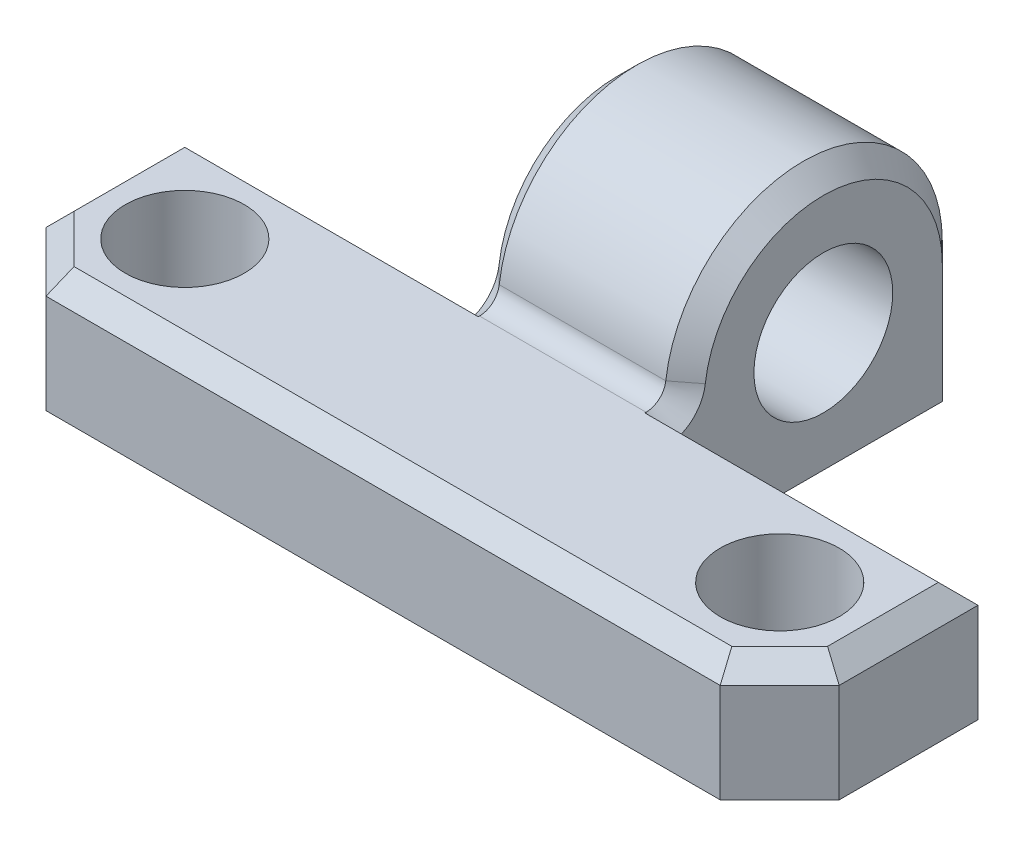
ISO-10303-21;
HEADER;
FILE_DESCRIPTION(('STEP AP214'),'2;1');
FILE_NAME('part.step','',(''),(''),'','','');
FILE_SCHEMA(('AUTOMOTIVE_DESIGN { 1 0 10303 214 1 1 1 1 }'));
ENDSEC;
DATA;
#1=APPLICATION_CONTEXT('core data for automotive mechanical design processes');
#2=APPLICATION_PROTOCOL_DEFINITION('international standard','automotive_design',2000,#1);
#3=PRODUCT_CONTEXT('',#1,'mechanical');
#4=PRODUCT('Part','Part','',(#3));
#5=PRODUCT_RELATED_PRODUCT_CATEGORY('part','',(#4));
#6=PRODUCT_DEFINITION_FORMATION('','',#4);
#7=PRODUCT_DEFINITION_CONTEXT('part definition',#1,'design');
#8=PRODUCT_DEFINITION('design','',#6,#7);
#9=PRODUCT_DEFINITION_SHAPE('','',#8);
#10=(LENGTH_UNIT() NAMED_UNIT(*) SI_UNIT(.MILLI.,.METRE.));
#11=(NAMED_UNIT(*) PLANE_ANGLE_UNIT() SI_UNIT($,.RADIAN.));
#12=(NAMED_UNIT(*) SI_UNIT($,.STERADIAN.) SOLID_ANGLE_UNIT());
#13=UNCERTAINTY_MEASURE_WITH_UNIT(LENGTH_MEASURE(1.E-05),#10,'distance_accuracy_value','');
#14=(GEOMETRIC_REPRESENTATION_CONTEXT(3) GLOBAL_UNCERTAINTY_ASSIGNED_CONTEXT((#13)) GLOBAL_UNIT_ASSIGNED_CONTEXT((#10,
#11,#12)) REPRESENTATION_CONTEXT('',''));
#15=CARTESIAN_POINT('',(0.,0.,0.));
#16=DIRECTION('',(0.,0.,1.));
#17=DIRECTION('',(1.,0.,0.));
#18=AXIS2_PLACEMENT_3D('',#15,#16,#17);
#19=CARTESIAN_POINT('',(-10.,3.,-6.));
#20=DIRECTION('',(1.,0.,0.));
#21=DIRECTION('',(0.,0.,-1.));
#22=AXIS2_PLACEMENT_3D('',#19,#20,#21);
#23=PLANE('',#22);
#24=DIRECTION('',(0.,1.,0.));
#25=VECTOR('',#24,1.);
#26=CARTESIAN_POINT('',(-10.,3.,4.5));
#27=LINE('',#26,#25);
#28=CARTESIAN_POINT('',(-10.,0.,4.5));
#29=VERTEX_POINT('',#28);
#30=CARTESIAN_POINT('',(-10.,2.5,4.5));
#31=VERTEX_POINT('',#30);
#32=EDGE_CURVE('E238',#29,#31,#27,.T.);
#33=ORIENTED_EDGE('',*,*,#32,.T.);
#34=DIRECTION('',(0.,0.,-1.));
#35=VECTOR('',#34,1.);
#36=CARTESIAN_POINT('',(-10.,2.5,-6.));
#37=LINE('',#36,#35);
#38=CARTESIAN_POINT('',(-10.,2.5,1.));
#39=VERTEX_POINT('',#38);
#40=EDGE_CURVE('E189',#31,#39,#37,.T.);
#41=ORIENTED_EDGE('',*,*,#40,.T.);
#42=DIRECTION('',(0.,-1.,0.));
#43=VECTOR('',#42,1.);
#44=CARTESIAN_POINT('',(-10.,6.5,1.));
#45=LINE('',#44,#43);
#46=CARTESIAN_POINT('',(-10.,0.,1.));
#47=VERTEX_POINT('',#46);
#48=EDGE_CURVE('E182',#39,#47,#45,.T.);
#49=ORIENTED_EDGE('',*,*,#48,.T.);
#50=DIRECTION('',(0.,0.,1.));
#51=VECTOR('',#50,1.);
#52=CARTESIAN_POINT('',(-10.,0.,-6.));
#53=LINE('',#52,#51);
#54=EDGE_CURVE('E186',#47,#29,#53,.T.);
#55=ORIENTED_EDGE('',*,*,#54,.T.);
#56=EDGE_LOOP('',(#33,#41,#49,#55));
#57=FACE_BOUND('',#56,.T.);
#58=ADVANCED_FACE('F37',(#57),#23,.F.);
#59=CARTESIAN_POINT('',(10.,3.,-6.));
#60=DIRECTION('',(-1.,0.,0.));
#61=DIRECTION('',(0.,0.,1.));
#62=AXIS2_PLACEMENT_3D('',#59,#60,#61);
#63=PLANE('',#62);
#64=DIRECTION('',(0.,-1.,0.));
#65=VECTOR('',#64,1.);
#66=CARTESIAN_POINT('',(10.,6.5,1.));
#67=LINE('',#66,#65);
#68=CARTESIAN_POINT('',(10.,2.5,1.));
#69=VERTEX_POINT('',#68);
#70=CARTESIAN_POINT('',(10.,0.,1.));
#71=VERTEX_POINT('',#70);
#72=EDGE_CURVE('E496',#69,#71,#67,.T.);
#73=ORIENTED_EDGE('',*,*,#72,.F.);
#74=DIRECTION('',(0.,0.,1.));
#75=VECTOR('',#74,1.);
#76=CARTESIAN_POINT('',(10.,2.5,-6.));
#77=LINE('',#76,#75);
#78=CARTESIAN_POINT('',(10.,2.5,4.5));
#79=VERTEX_POINT('',#78);
#80=EDGE_CURVE('E265',#69,#79,#77,.T.);
#81=ORIENTED_EDGE('',*,*,#80,.T.);
#82=DIRECTION('',(0.,-1.,0.));
#83=VECTOR('',#82,1.);
#84=CARTESIAN_POINT('',(10.,3.,4.5));
#85=LINE('',#84,#83);
#86=CARTESIAN_POINT('',(10.,0.,4.5));
#87=VERTEX_POINT('',#86);
#88=EDGE_CURVE('E228',#79,#87,#85,.T.);
#89=ORIENTED_EDGE('',*,*,#88,.T.);
#90=DIRECTION('',(0.,0.,-1.));
#91=VECTOR('',#90,1.);
#92=CARTESIAN_POINT('',(10.,0.,-6.));
#93=LINE('',#92,#91);
#94=EDGE_CURVE('E214',#87,#71,#93,.T.);
#95=ORIENTED_EDGE('',*,*,#94,.T.);
#96=EDGE_LOOP('',(#73,#81,#89,#95));
#97=FACE_BOUND('',#96,.T.);
#98=ADVANCED_FACE('F386',(#97),#63,.F.);
#99=CARTESIAN_POINT('',(10.,3.,-6.));
#100=DIRECTION('',(0.,0.,1.));
#101=DIRECTION('',(1.,0.,0.));
#102=AXIS2_PLACEMENT_3D('',#99,#100,#101);
#103=PLANE('',#102);
#104=DIRECTION('',(-1.,0.,0.));
#105=VECTOR('',#104,1.);
#106=CARTESIAN_POINT('',(10.,3.,-6.));
#107=LINE('',#106,#105);
#108=CARTESIAN_POINT('',(2.1,3.,-6.));
#109=VERTEX_POINT('',#108);
#110=CARTESIAN_POINT('',(-2.10000000000001,3.,-6.));
#111=VERTEX_POINT('',#110);
#112=EDGE_CURVE('E220',#109,#111,#107,.T.);
#113=ORIENTED_EDGE('',*,*,#112,.F.);
#114=DIRECTION('',(0.,-1.,0.));
#115=VECTOR('',#114,1.);
#116=CARTESIAN_POINT('',(2.1,0.,-6.));
#117=LINE('',#116,#115);
#118=CARTESIAN_POINT('',(2.1,0.,-6.));
#119=VERTEX_POINT('',#118);
#120=EDGE_CURVE('E322',#109,#119,#117,.T.);
#121=ORIENTED_EDGE('',*,*,#120,.T.);
#122=DIRECTION('',(-1.,0.,0.));
#123=VECTOR('',#122,1.);
#124=CARTESIAN_POINT('',(10.,0.,-6.));
#125=LINE('',#124,#123);
#126=CARTESIAN_POINT('',(-2.10000000000001,0.,-6.));
#127=VERTEX_POINT('',#126);
#128=EDGE_CURVE('E225',#119,#127,#125,.T.);
#129=ORIENTED_EDGE('',*,*,#128,.T.);
#130=DIRECTION('',(0.,1.,0.));
#131=VECTOR('',#130,1.);
#132=CARTESIAN_POINT('',(-2.10000000000001,3.,-6.));
#133=LINE('',#132,#131);
#134=EDGE_CURVE('E320',#127,#111,#133,.T.);
#135=ORIENTED_EDGE('',*,*,#134,.T.);
#136=EDGE_LOOP('',(#113,#121,#129,#135));
#137=FACE_BOUND('',#136,.T.);
#138=ADVANCED_FACE('F392',(#137),#103,.F.);
#139=CARTESIAN_POINT('',(0.,0.,0.));
#140=DIRECTION('',(0.,-1.,0.));
#141=DIRECTION('',(0.,0.,-1.));
#142=AXIS2_PLACEMENT_3D('',#139,#140,#141);
#143=PLANE('',#142);
#144=CARTESIAN_POINT('',(-7.5,0.,3.5));
#145=DIRECTION('',(0.,-1.,0.));
#146=DIRECTION('',(0.,0.,-1.));
#147=AXIS2_PLACEMENT_3D('',#144,#145,#146);
#148=CIRCLE('',#147,1.5);
#149=CARTESIAN_POINT('',(-7.5,0.,5.));
#150=VERTEX_POINT('',#149);
#151=EDGE_CURVE('E217',#150,#150,#148,.F.);
#152=ORIENTED_EDGE('',*,*,#151,.T.);
#153=EDGE_LOOP('',(#152));
#154=FACE_BOUND('',#153,.T.);
#155=CARTESIAN_POINT('',(7.5,0.,3.5));
#156=DIRECTION('',(0.,-1.,0.));
#157=DIRECTION('',(0.,0.,-1.));
#158=AXIS2_PLACEMENT_3D('',#155,#156,#157);
#159=CIRCLE('',#158,1.5);
#160=CARTESIAN_POINT('',(7.5,0.,5.));
#161=VERTEX_POINT('',#160);
#162=EDGE_CURVE('E246',#161,#161,#159,.F.);
#163=ORIENTED_EDGE('',*,*,#162,.T.);
#164=EDGE_LOOP('',(#163));
#165=FACE_BOUND('',#164,.T.);
#166=ORIENTED_EDGE('',*,*,#128,.F.);
#167=DIRECTION('',(0.707106781186547,0.,0.707106781186548));
#168=VECTOR('',#167,1.);
#169=CARTESIAN_POINT('',(4.05,0.,-4.05));
#170=LINE('',#169,#168);
#171=CARTESIAN_POINT('',(2.6,0.,-5.5));
#172=VERTEX_POINT('',#171);
#173=EDGE_CURVE('E326',#119,#172,#170,.T.);
#174=ORIENTED_EDGE('',*,*,#173,.T.);
#175=DIRECTION('',(0.,0.,1.));
#176=VECTOR('',#175,1.);
#177=CARTESIAN_POINT('',(2.6,0.,-6.));
#178=LINE('',#177,#176);
#179=CARTESIAN_POINT('',(2.6,0.,1.));
#180=VERTEX_POINT('',#179);
#181=EDGE_CURVE('E298',#172,#180,#178,.T.);
#182=ORIENTED_EDGE('',*,*,#181,.T.);
#183=DIRECTION('',(1.,0.,0.));
#184=VECTOR('',#183,1.);
#185=CARTESIAN_POINT('',(10.,0.,1.));
#186=LINE('',#185,#184);
#187=EDGE_CURVE('E494',#180,#71,#186,.T.);
#188=ORIENTED_EDGE('',*,*,#187,.T.);
#189=ORIENTED_EDGE('',*,*,#94,.F.);
#190=DIRECTION('',(0.707106781186549,0.,-0.707106781186546));
#191=VECTOR('',#190,1.);
#192=CARTESIAN_POINT('',(7.24999999999998,0.,7.25000000000001));
#193=LINE('',#192,#191);
#194=CARTESIAN_POINT('',(8.49999999999999,0.,6.));
#195=VERTEX_POINT('',#194);
#196=EDGE_CURVE('E231',#87,#195,#193,.F.);
#197=ORIENTED_EDGE('',*,*,#196,.T.);
#198=DIRECTION('',(1.,0.,0.));
#199=VECTOR('',#198,1.);
#200=CARTESIAN_POINT('',(10.,0.,6.));
#201=LINE('',#200,#199);
#202=CARTESIAN_POINT('',(-8.5,0.,6.));
#203=VERTEX_POINT('',#202);
#204=EDGE_CURVE('E210',#203,#195,#201,.T.);
#205=ORIENTED_EDGE('',*,*,#204,.F.);
#206=DIRECTION('',(0.707106781186546,0.,0.707106781186549));
#207=VECTOR('',#206,1.);
#208=CARTESIAN_POINT('',(-7.25000000000002,0.,7.24999999999999));
#209=LINE('',#208,#207);
#210=EDGE_CURVE('E208',#203,#29,#209,.F.);
#211=ORIENTED_EDGE('',*,*,#210,.T.);
#212=ORIENTED_EDGE('',*,*,#54,.F.);
#213=DIRECTION('',(1.,0.,0.));
#214=VECTOR('',#213,1.);
#215=CARTESIAN_POINT('',(-10.,0.,1.));
#216=LINE('',#215,#214);
#217=CARTESIAN_POINT('',(-2.6,0.,1.));
#218=VERTEX_POINT('',#217);
#219=EDGE_CURVE('E196',#47,#218,#216,.T.);
#220=ORIENTED_EDGE('',*,*,#219,.T.);
#221=DIRECTION('',(0.,0.,-1.));
#222=VECTOR('',#221,1.);
#223=CARTESIAN_POINT('',(-2.6,0.,-6.));
#224=LINE('',#223,#222);
#225=CARTESIAN_POINT('',(-2.6,0.,-5.50000000000001));
#226=VERTEX_POINT('',#225);
#227=EDGE_CURVE('E202',#218,#226,#224,.T.);
#228=ORIENTED_EDGE('',*,*,#227,.T.);
#229=DIRECTION('',(0.707106781186547,0.,-0.707106781186548));
#230=VECTOR('',#229,1.);
#231=CARTESIAN_POINT('',(-4.05000000000001,0.,-4.05));
#232=LINE('',#231,#230);
#233=EDGE_CURVE('E324',#226,#127,#232,.T.);
#234=ORIENTED_EDGE('',*,*,#233,.T.);
#235=EDGE_LOOP('',(#166,#174,#182,#188,#189,#197,#205,#211,#212,#220,#228,#234));
#236=FACE_BOUND('',#235,.T.);
#237=ADVANCED_FACE('F205',(#154,#165,#236),#143,.T.);
#238=CARTESIAN_POINT('',(10.,3.,-2.5));
#239=DIRECTION('',(-1.,0.,0.));
#240=DIRECTION('',(0.,0.,1.));
#241=AXIS2_PLACEMENT_3D('',#238,#239,#240);
#242=CYLINDRICAL_SURFACE('',#241,3.5);
#243=DIRECTION('',(-1.,0.,0.));
#244=VECTOR('',#243,1.);
#245=CARTESIAN_POINT('',(10.,3.4375,0.972548595772275));
#246=LINE('',#245,#244);
#247=CARTESIAN_POINT('',(-2.10000000000001,3.4375,0.972548595772275));
#248=VERTEX_POINT('',#247);
#249=CARTESIAN_POINT('',(2.1,3.4375,0.972548595772275));
#250=VERTEX_POINT('',#249);
#251=EDGE_CURVE('E301',#248,#250,#246,.F.);
#252=ORIENTED_EDGE('',*,*,#251,.T.);
#253=CARTESIAN_POINT('',(2.1,3.,-2.5));
#254=DIRECTION('',(1.,0.,0.));
#255=DIRECTION('',(0.,0.,-1.));
#256=AXIS2_PLACEMENT_3D('',#253,#254,#255);
#257=CIRCLE('',#256,3.5);
#258=EDGE_CURVE('E330',#250,#109,#257,.F.);
#259=ORIENTED_EDGE('',*,*,#258,.T.);
#260=ORIENTED_EDGE('',*,*,#112,.T.);
#261=CARTESIAN_POINT('',(-2.10000000000001,3.,-2.5));
#262=DIRECTION('',(-1.,0.,0.));
#263=DIRECTION('',(0.,0.,1.));
#264=AXIS2_PLACEMENT_3D('',#261,#262,#263);
#265=CIRCLE('',#264,3.5);
#266=EDGE_CURVE('E328',#111,#248,#265,.F.);
#267=ORIENTED_EDGE('',*,*,#266,.T.);
#268=EDGE_LOOP('',(#252,#259,#260,#267));
#269=FACE_BOUND('',#268,.T.);
#270=ADVANCED_FACE('F478',(#269),#242,.T.);
#271=CARTESIAN_POINT('',(10.,3.,6.));
#272=DIRECTION('',(0.,0.,-1.));
#273=DIRECTION('',(-1.,0.,0.));
#274=AXIS2_PLACEMENT_3D('',#271,#272,#273);
#275=PLANE('',#274);
#276=DIRECTION('',(0.,1.,0.));
#277=VECTOR('',#276,1.);
#278=CARTESIAN_POINT('',(8.49999999999999,3.,6.));
#279=LINE('',#278,#277);
#280=CARTESIAN_POINT('',(8.49999999999999,2.5,6.));
#281=VERTEX_POINT('',#280);
#282=EDGE_CURVE('E235',#195,#281,#279,.T.);
#283=ORIENTED_EDGE('',*,*,#282,.T.);
#284=DIRECTION('',(-1.,0.,0.));
#285=VECTOR('',#284,1.);
#286=CARTESIAN_POINT('',(10.,2.5,6.));
#287=LINE('',#286,#285);
#288=CARTESIAN_POINT('',(-8.5,2.5,6.));
#289=VERTEX_POINT('',#288);
#290=EDGE_CURVE('E269',#281,#289,#287,.T.);
#291=ORIENTED_EDGE('',*,*,#290,.T.);
#292=DIRECTION('',(0.,-1.,0.));
#293=VECTOR('',#292,1.);
#294=CARTESIAN_POINT('',(-8.5,3.,6.));
#295=LINE('',#294,#293);
#296=EDGE_CURVE('E233',#289,#203,#295,.T.);
#297=ORIENTED_EDGE('',*,*,#296,.T.);
#298=ORIENTED_EDGE('',*,*,#204,.T.);
#299=EDGE_LOOP('',(#283,#291,#297,#298));
#300=FACE_BOUND('',#299,.T.);
#301=ADVANCED_FACE('F397',(#300),#275,.F.);
#302=CARTESIAN_POINT('',(0.,3.,0.));
#303=DIRECTION('',(0.,-1.,0.));
#304=DIRECTION('',(0.,0.,-1.));
#305=AXIS2_PLACEMENT_3D('',#302,#303,#304);
#306=PLANE('',#305);
#307=DIRECTION('',(-1.,0.,0.));
#308=VECTOR('',#307,1.);
#309=CARTESIAN_POINT('',(2.6,3.,1.5));
#310=LINE('',#309,#308);
#311=CARTESIAN_POINT('',(9.5,3.,1.5));
#312=VERTEX_POINT('',#311);
#313=CARTESIAN_POINT('',(2.1,3.,1.5));
#314=VERTEX_POINT('',#313);
#315=EDGE_CURVE('E256',#312,#314,#310,.T.);
#316=ORIENTED_EDGE('',*,*,#315,.T.);
#317=DIRECTION('',(0.,0.,-1.));
#318=VECTOR('',#317,1.);
#319=CARTESIAN_POINT('',(2.1,3.,1.46862696659689));
#320=LINE('',#319,#318);
#321=CARTESIAN_POINT('',(2.1,3.,1.46862696659689));
#322=VERTEX_POINT('',#321);
#323=EDGE_CURVE('E307',#314,#322,#320,.T.);
#324=ORIENTED_EDGE('',*,*,#323,.T.);
#325=DIRECTION('',(-1.,0.,0.));
#326=VECTOR('',#325,1.);
#327=CARTESIAN_POINT('',(0.,3.,1.46862696659689));
#328=LINE('',#327,#326);
#329=CARTESIAN_POINT('',(-2.10000000000001,3.,1.46862696659689));
#330=VERTEX_POINT('',#329);
#331=EDGE_CURVE('E279',#322,#330,#328,.T.);
#332=ORIENTED_EDGE('',*,*,#331,.T.);
#333=DIRECTION('',(0.,0.,1.));
#334=VECTOR('',#333,1.);
#335=CARTESIAN_POINT('',(-2.10000000000001,3.,1.5));
#336=LINE('',#335,#334);
#337=CARTESIAN_POINT('',(-2.10000000000001,3.,1.5));
#338=VERTEX_POINT('',#337);
#339=EDGE_CURVE('E304',#330,#338,#336,.T.);
#340=ORIENTED_EDGE('',*,*,#339,.T.);
#341=DIRECTION('',(-1.,0.,0.));
#342=VECTOR('',#341,1.);
#343=CARTESIAN_POINT('',(-10.,3.,1.5));
#344=LINE('',#343,#342);
#345=CARTESIAN_POINT('',(-9.5,3.,1.5));
#346=VERTEX_POINT('',#345);
#347=EDGE_CURVE('E258',#338,#346,#344,.T.);
#348=ORIENTED_EDGE('',*,*,#347,.T.);
#349=DIRECTION('',(0.,0.,1.));
#350=VECTOR('',#349,1.);
#351=CARTESIAN_POINT('',(-9.5,3.,0.));
#352=LINE('',#351,#350);
#353=CARTESIAN_POINT('',(-9.5,3.,4.29289321881345));
#354=VERTEX_POINT('',#353);
#355=EDGE_CURVE('E240',#346,#354,#352,.T.);
#356=ORIENTED_EDGE('',*,*,#355,.T.);
#357=DIRECTION('',(0.707106781186546,0.,0.707106781186549));
#358=VECTOR('',#357,1.);
#359=CARTESIAN_POINT('',(-8.14644660940673,3.,5.64644660940673));
#360=LINE('',#359,#358);
#361=CARTESIAN_POINT('',(-8.29289321881345,3.,5.5));
#362=VERTEX_POINT('',#361);
#363=EDGE_CURVE('E248',#354,#362,#360,.T.);
#364=ORIENTED_EDGE('',*,*,#363,.T.);
#365=DIRECTION('',(1.,0.,0.));
#366=VECTOR('',#365,1.);
#367=CARTESIAN_POINT('',(0.,3.,5.5));
#368=LINE('',#367,#366);
#369=CARTESIAN_POINT('',(8.29289321881345,3.,5.5));
#370=VERTEX_POINT('',#369);
#371=EDGE_CURVE('E250',#362,#370,#368,.T.);
#372=ORIENTED_EDGE('',*,*,#371,.T.);
#373=DIRECTION('',(0.707106781186549,0.,-0.707106781186546));
#374=VECTOR('',#373,1.);
#375=CARTESIAN_POINT('',(9.64644660940673,3.,4.14644660940672));
#376=LINE('',#375,#374);
#377=CARTESIAN_POINT('',(9.5,3.,4.29289321881345));
#378=VERTEX_POINT('',#377);
#379=EDGE_CURVE('E252',#370,#378,#376,.T.);
#380=ORIENTED_EDGE('',*,*,#379,.T.);
#381=DIRECTION('',(0.,0.,-1.));
#382=VECTOR('',#381,1.);
#383=CARTESIAN_POINT('',(9.5,3.,0.));
#384=LINE('',#383,#382);
#385=EDGE_CURVE('E254',#378,#312,#384,.T.);
#386=ORIENTED_EDGE('',*,*,#385,.T.);
#387=EDGE_LOOP('',(#316,#324,#332,#340,#348,#356,#364,#372,#380,#386));
#388=FACE_BOUND('',#387,.T.);
#389=CARTESIAN_POINT('',(-7.5,3.,3.5));
#390=DIRECTION('',(0.,1.,0.));
#391=DIRECTION('',(0.,0.,1.));
#392=AXIS2_PLACEMENT_3D('',#389,#390,#391);
#393=CIRCLE('',#392,1.5);
#394=CARTESIAN_POINT('',(-7.5,3.,5.));
#395=VERTEX_POINT('',#394);
#396=EDGE_CURVE('E211',#395,#395,#393,.T.);
#397=ORIENTED_EDGE('',*,*,#396,.F.);
#398=EDGE_LOOP('',(#397));
#399=FACE_BOUND('',#398,.T.);
#400=CARTESIAN_POINT('',(7.5,3.,3.5));
#401=DIRECTION('',(0.,1.,0.));
#402=DIRECTION('',(0.,0.,-1.));
#403=AXIS2_PLACEMENT_3D('',#400,#401,#402);
#404=CIRCLE('',#403,1.5);
#405=CARTESIAN_POINT('',(7.5,3.,5.));
#406=VERTEX_POINT('',#405);
#407=EDGE_CURVE('E504',#406,#406,#404,.T.);
#408=ORIENTED_EDGE('',*,*,#407,.F.);
#409=EDGE_LOOP('',(#408));
#410=FACE_BOUND('',#409,.T.);
#411=ADVANCED_FACE('F513',(#388,#399,#410),#306,.F.);
#412=CARTESIAN_POINT('',(7.5,-0.00100000000000013,3.5));
#413=DIRECTION('',(0.,1.,0.));
#414=DIRECTION('',(0.,0.,1.));
#415=AXIS2_PLACEMENT_3D('',#412,#413,#414);
#416=CYLINDRICAL_SURFACE('',#415,1.5);
#417=CARTESIAN_POINT('',(7.5,0.,5.));
#418=CARTESIAN_POINT('',(7.5,0.03125,5.));
#419=CARTESIAN_POINT('',(7.5,0.0625,5.));
#420=CARTESIAN_POINT('',(7.5,0.125,5.));
#421=CARTESIAN_POINT('',(7.5,0.15625,5.));
#422=CARTESIAN_POINT('',(7.5,0.21875,5.));
#423=CARTESIAN_POINT('',(7.5,0.25,5.));
#424=CARTESIAN_POINT('',(7.5,0.3125,5.));
#425=CARTESIAN_POINT('',(7.5,0.34375,5.));
#426=CARTESIAN_POINT('',(7.5,0.40625,5.));
#427=CARTESIAN_POINT('',(7.5,0.4375,5.));
#428=CARTESIAN_POINT('',(7.5,0.5,5.));
#429=CARTESIAN_POINT('',(7.5,0.53125,5.));
#430=CARTESIAN_POINT('',(7.5,0.59375,5.));
#431=CARTESIAN_POINT('',(7.5,0.625,5.));
#432=CARTESIAN_POINT('',(7.5,0.6875,5.));
#433=CARTESIAN_POINT('',(7.5,0.71875,5.));
#434=CARTESIAN_POINT('',(7.5,0.78125,5.));
#435=CARTESIAN_POINT('',(7.5,0.8125,5.));
#436=CARTESIAN_POINT('',(7.5,0.875,5.));
#437=CARTESIAN_POINT('',(7.5,0.90625,5.));
#438=CARTESIAN_POINT('',(7.5,0.96875,5.));
#439=CARTESIAN_POINT('',(7.5,1.,5.));
#440=CARTESIAN_POINT('',(7.5,1.0625,5.));
#441=CARTESIAN_POINT('',(7.5,1.09375,5.));
#442=CARTESIAN_POINT('',(7.5,1.15625,5.));
#443=CARTESIAN_POINT('',(7.5,1.1875,5.));
#444=CARTESIAN_POINT('',(7.5,1.25,5.));
#445=CARTESIAN_POINT('',(7.5,1.28125,5.));
#446=CARTESIAN_POINT('',(7.5,1.34375,5.));
#447=CARTESIAN_POINT('',(7.5,1.375,5.));
#448=CARTESIAN_POINT('',(7.5,1.4375,5.));
#449=CARTESIAN_POINT('',(7.5,1.46875,5.));
#450=CARTESIAN_POINT('',(7.5,1.53125,5.));
#451=CARTESIAN_POINT('',(7.5,1.5625,5.));
#452=CARTESIAN_POINT('',(7.5,1.625,5.));
#453=CARTESIAN_POINT('',(7.5,1.65625,5.));
#454=CARTESIAN_POINT('',(7.5,1.71875,5.));
#455=CARTESIAN_POINT('',(7.5,1.75,5.));
#456=CARTESIAN_POINT('',(7.5,1.8125,5.));
#457=CARTESIAN_POINT('',(7.5,1.84375,5.));
#458=CARTESIAN_POINT('',(7.5,1.90625,5.));
#459=CARTESIAN_POINT('',(7.5,1.9375,5.));
#460=CARTESIAN_POINT('',(7.5,2.,5.));
#461=CARTESIAN_POINT('',(7.5,2.03125,5.));
#462=CARTESIAN_POINT('',(7.5,2.09375,5.));
#463=CARTESIAN_POINT('',(7.5,2.125,5.));
#464=CARTESIAN_POINT('',(7.5,2.1875,5.));
#465=CARTESIAN_POINT('',(7.5,2.21875,5.));
#466=CARTESIAN_POINT('',(7.5,2.28125,5.));
#467=CARTESIAN_POINT('',(7.5,2.3125,5.));
#468=CARTESIAN_POINT('',(7.5,2.375,5.));
#469=CARTESIAN_POINT('',(7.5,2.40625,5.));
#470=CARTESIAN_POINT('',(7.5,2.46875,5.));
#471=CARTESIAN_POINT('',(7.5,2.5,5.));
#472=CARTESIAN_POINT('',(7.5,2.5625,5.));
#473=CARTESIAN_POINT('',(7.5,2.59375,5.));
#474=CARTESIAN_POINT('',(7.5,2.65625,5.));
#475=CARTESIAN_POINT('',(7.5,2.6875,5.));
#476=CARTESIAN_POINT('',(7.5,2.75,5.));
#477=CARTESIAN_POINT('',(7.5,2.78125,5.));
#478=CARTESIAN_POINT('',(7.5,2.84375,5.));
#479=CARTESIAN_POINT('',(7.5,2.875,5.));
#480=CARTESIAN_POINT('',(7.5,2.9375,5.));
#481=CARTESIAN_POINT('',(7.5,2.96875,5.));
#482=CARTESIAN_POINT('',(7.5,3.,5.));
#483=B_SPLINE_CURVE_WITH_KNOTS('',3,(#417,#418,#419,#420,#421,#422,#423,#424,#425,#426,#427,
#428,#429,#430,#431,#432,#433,#434,#435,#436,#437,#438,#439,#440,#441,#442,#443,#444,#445,#446,
#447,#448,#449,#450,#451,#452,#453,#454,#455,#456,#457,#458,#459,#460,#461,#462,#463,#464,#465,
#466,#467,#468,#469,#470,#471,#472,#473,#474,#475,#476,#477,#478,#479,#480,#481,#482),
.UNSPECIFIED.,.F.,.F.,(4,2,2,2,2,2,2,2,2,2,2,2,2,2,2,2,2,2,2,2,2,2,2,2,2,2,2,2,2,2,2,2,4),(0.,
0.09375,0.1875,0.28125,0.375,0.46875,0.5625,0.65625,0.75,0.84375,0.9375,1.03125,1.125,1.21875,
1.3125,1.40625,1.5,1.59375,1.6875,1.78125,1.875,1.96875,2.0625,2.15625,2.25,2.34375,2.4375,
2.53125,2.625,2.71875,2.8125,2.90625,3.),.UNSPECIFIED.);
#484=EDGE_CURVE('BSEAM510',#161,#406,#483,.T.);
#485=ORIENTED_EDGE('',*,*,#162,.F.);
#486=ORIENTED_EDGE('',*,*,#407,.T.);
#487=ORIENTED_EDGE('',*,*,#484,.T.);
#488=ORIENTED_EDGE('',*,*,#484,.F.);
#489=EDGE_LOOP('',(#485,#487,#486,#488));
#490=FACE_BOUND('',#489,.T.);
#491=ADVANCED_FACE('F510',(#490),#416,.F.);
#492=CARTESIAN_POINT('',(-7.5,-0.00100000000000013,3.5));
#493=DIRECTION('',(0.,1.,0.));
#494=DIRECTION('',(0.,0.,1.));
#495=AXIS2_PLACEMENT_3D('',#492,#493,#494);
#496=CYLINDRICAL_SURFACE('',#495,1.5);
#497=CARTESIAN_POINT('',(-7.5,0.,5.));
#498=CARTESIAN_POINT('',(-7.5,0.03125,5.));
#499=CARTESIAN_POINT('',(-7.5,0.0625,5.));
#500=CARTESIAN_POINT('',(-7.5,0.125,5.));
#501=CARTESIAN_POINT('',(-7.5,0.15625,5.));
#502=CARTESIAN_POINT('',(-7.5,0.21875,5.));
#503=CARTESIAN_POINT('',(-7.5,0.25,5.));
#504=CARTESIAN_POINT('',(-7.5,0.3125,5.));
#505=CARTESIAN_POINT('',(-7.5,0.34375,5.));
#506=CARTESIAN_POINT('',(-7.5,0.40625,5.));
#507=CARTESIAN_POINT('',(-7.5,0.4375,5.));
#508=CARTESIAN_POINT('',(-7.5,0.5,5.));
#509=CARTESIAN_POINT('',(-7.5,0.53125,5.));
#510=CARTESIAN_POINT('',(-7.5,0.59375,5.));
#511=CARTESIAN_POINT('',(-7.5,0.625,5.));
#512=CARTESIAN_POINT('',(-7.5,0.6875,5.));
#513=CARTESIAN_POINT('',(-7.5,0.71875,5.));
#514=CARTESIAN_POINT('',(-7.5,0.78125,5.));
#515=CARTESIAN_POINT('',(-7.5,0.8125,5.));
#516=CARTESIAN_POINT('',(-7.5,0.875,5.));
#517=CARTESIAN_POINT('',(-7.5,0.90625,5.));
#518=CARTESIAN_POINT('',(-7.5,0.96875,5.));
#519=CARTESIAN_POINT('',(-7.5,1.,5.));
#520=CARTESIAN_POINT('',(-7.5,1.0625,5.));
#521=CARTESIAN_POINT('',(-7.5,1.09375,5.));
#522=CARTESIAN_POINT('',(-7.5,1.15625,5.));
#523=CARTESIAN_POINT('',(-7.5,1.1875,5.));
#524=CARTESIAN_POINT('',(-7.5,1.25,5.));
#525=CARTESIAN_POINT('',(-7.5,1.28125,5.));
#526=CARTESIAN_POINT('',(-7.5,1.34375,5.));
#527=CARTESIAN_POINT('',(-7.5,1.375,5.));
#528=CARTESIAN_POINT('',(-7.5,1.4375,5.));
#529=CARTESIAN_POINT('',(-7.5,1.46875,5.));
#530=CARTESIAN_POINT('',(-7.5,1.53125,5.));
#531=CARTESIAN_POINT('',(-7.5,1.5625,5.));
#532=CARTESIAN_POINT('',(-7.5,1.625,5.));
#533=CARTESIAN_POINT('',(-7.5,1.65625,5.));
#534=CARTESIAN_POINT('',(-7.5,1.71875,5.));
#535=CARTESIAN_POINT('',(-7.5,1.75,5.));
#536=CARTESIAN_POINT('',(-7.5,1.8125,5.));
#537=CARTESIAN_POINT('',(-7.5,1.84375,5.));
#538=CARTESIAN_POINT('',(-7.5,1.90625,5.));
#539=CARTESIAN_POINT('',(-7.5,1.9375,5.));
#540=CARTESIAN_POINT('',(-7.5,2.,5.));
#541=CARTESIAN_POINT('',(-7.5,2.03125,5.));
#542=CARTESIAN_POINT('',(-7.5,2.09375,5.));
#543=CARTESIAN_POINT('',(-7.5,2.125,5.));
#544=CARTESIAN_POINT('',(-7.5,2.1875,5.));
#545=CARTESIAN_POINT('',(-7.5,2.21875,5.));
#546=CARTESIAN_POINT('',(-7.5,2.28125,5.));
#547=CARTESIAN_POINT('',(-7.5,2.3125,5.));
#548=CARTESIAN_POINT('',(-7.5,2.375,5.));
#549=CARTESIAN_POINT('',(-7.5,2.40625,5.));
#550=CARTESIAN_POINT('',(-7.5,2.46875,5.));
#551=CARTESIAN_POINT('',(-7.5,2.5,5.));
#552=CARTESIAN_POINT('',(-7.5,2.5625,5.));
#553=CARTESIAN_POINT('',(-7.5,2.59375,5.));
#554=CARTESIAN_POINT('',(-7.5,2.65625,5.));
#555=CARTESIAN_POINT('',(-7.5,2.6875,5.));
#556=CARTESIAN_POINT('',(-7.5,2.75,5.));
#557=CARTESIAN_POINT('',(-7.5,2.78125,5.));
#558=CARTESIAN_POINT('',(-7.5,2.84375,5.));
#559=CARTESIAN_POINT('',(-7.5,2.875,5.));
#560=CARTESIAN_POINT('',(-7.5,2.9375,5.));
#561=CARTESIAN_POINT('',(-7.5,2.96875,5.));
#562=CARTESIAN_POINT('',(-7.5,3.,5.));
#563=B_SPLINE_CURVE_WITH_KNOTS('',3,(#497,#498,#499,#500,#501,#502,#503,#504,#505,#506,#507,
#508,#509,#510,#511,#512,#513,#514,#515,#516,#517,#518,#519,#520,#521,#522,#523,#524,#525,#526,
#527,#528,#529,#530,#531,#532,#533,#534,#535,#536,#537,#538,#539,#540,#541,#542,#543,#544,#545,
#546,#547,#548,#549,#550,#551,#552,#553,#554,#555,#556,#557,#558,#559,#560,#561,#562),
.UNSPECIFIED.,.F.,.F.,(4,2,2,2,2,2,2,2,2,2,2,2,2,2,2,2,2,2,2,2,2,2,2,2,2,2,2,2,2,2,2,2,4),(0.,
0.09375,0.1875,0.28125,0.375,0.46875,0.5625,0.65625,0.75,0.84375,0.9375,1.03125,1.125,1.21875,
1.3125,1.40625,1.5,1.59375,1.6875,1.78125,1.875,1.96875,2.0625,2.15625,2.25,2.34375,2.4375,
2.53125,2.625,2.71875,2.8125,2.90625,3.),.UNSPECIFIED.);
#564=EDGE_CURVE('BSEAM405',#150,#395,#563,.T.);
#565=ORIENTED_EDGE('',*,*,#151,.F.);
#566=ORIENTED_EDGE('',*,*,#396,.T.);
#567=ORIENTED_EDGE('',*,*,#564,.T.);
#568=ORIENTED_EDGE('',*,*,#564,.F.);
#569=EDGE_LOOP('',(#565,#567,#566,#568));
#570=FACE_BOUND('',#569,.T.);
#571=ADVANCED_FACE('F405',(#570),#496,.F.);
#572=CARTESIAN_POINT('',(10.,3.,4.5));
#573=DIRECTION('',(-0.707106781186546,0.,-0.707106781186549));
#574=DIRECTION('',(0.,-1.,0.));
#575=AXIS2_PLACEMENT_3D('',#572,#573,#574);
#576=PLANE('',#575);
#577=ORIENTED_EDGE('',*,*,#88,.F.);
#578=DIRECTION('',(0.707106781186549,0.,-0.707106781186546));
#579=VECTOR('',#578,1.);
#580=CARTESIAN_POINT('',(8.49999999999999,2.5,6.));
#581=LINE('',#580,#579);
#582=EDGE_CURVE('E267',#79,#281,#581,.F.);
#583=ORIENTED_EDGE('',*,*,#582,.T.);
#584=ORIENTED_EDGE('',*,*,#282,.F.);
#585=ORIENTED_EDGE('',*,*,#196,.F.);
#586=EDGE_LOOP('',(#577,#583,#584,#585));
#587=FACE_BOUND('',#586,.T.);
#588=ADVANCED_FACE('F399',(#587),#576,.F.);
#589=CARTESIAN_POINT('',(-8.5,3.,6.));
#590=DIRECTION('',(0.707106781186549,0.,-0.707106781186546));
#591=DIRECTION('',(0.,-1.,0.));
#592=AXIS2_PLACEMENT_3D('',#589,#590,#591);
#593=PLANE('',#592);
#594=ORIENTED_EDGE('',*,*,#296,.F.);
#595=DIRECTION('',(0.707106781186546,0.,0.707106781186549));
#596=VECTOR('',#595,1.);
#597=CARTESIAN_POINT('',(-10.,2.5,4.5));
#598=LINE('',#597,#596);
#599=EDGE_CURVE('E271',#289,#31,#598,.F.);
#600=ORIENTED_EDGE('',*,*,#599,.T.);
#601=ORIENTED_EDGE('',*,*,#32,.F.);
#602=ORIENTED_EDGE('',*,*,#210,.F.);
#603=EDGE_LOOP('',(#594,#600,#601,#602));
#604=FACE_BOUND('',#603,.T.);
#605=ADVANCED_FACE('F404',(#604),#593,.F.);
#606=CARTESIAN_POINT('',(10.,6.5,1.));
#607=DIRECTION('',(0.,0.,-1.));
#608=DIRECTION('',(-1.,0.,0.));
#609=AXIS2_PLACEMENT_3D('',#606,#607,#608);
#610=PLANE('',#609);
#611=DIRECTION('',(0.,-1.,0.));
#612=VECTOR('',#611,1.);
#613=CARTESIAN_POINT('',(2.6,6.5,1.));
#614=LINE('',#613,#612);
#615=CARTESIAN_POINT('',(2.6,2.5,1.));
#616=VERTEX_POINT('',#615);
#617=EDGE_CURVE('E492',#616,#180,#614,.T.);
#618=ORIENTED_EDGE('',*,*,#617,.F.);
#619=DIRECTION('',(1.,0.,0.));
#620=VECTOR('',#619,1.);
#621=CARTESIAN_POINT('',(10.,2.5,1.));
#622=LINE('',#621,#620);
#623=EDGE_CURVE('E263',#616,#69,#622,.T.);
#624=ORIENTED_EDGE('',*,*,#623,.T.);
#625=ORIENTED_EDGE('',*,*,#72,.T.);
#626=ORIENTED_EDGE('',*,*,#187,.F.);
#627=EDGE_LOOP('',(#618,#624,#625,#626));
#628=FACE_BOUND('',#627,.T.);
#629=ADVANCED_FACE('F411',(#628),#610,.T.);
#630=CARTESIAN_POINT('',(2.6,6.5,-6.));
#631=DIRECTION('',(1.,0.,0.));
#632=DIRECTION('',(0.,0.,-1.));
#633=AXIS2_PLACEMENT_3D('',#630,#631,#632);
#634=PLANE('',#633);
#635=CARTESIAN_POINT('',(2.6,3.,-2.5));
#636=DIRECTION('',(1.,0.,0.));
#637=DIRECTION('',(0.,0.,-1.));
#638=AXIS2_PLACEMENT_3D('',#635,#636,#637);
#639=CIRCLE('',#638,3.);
#640=CARTESIAN_POINT('',(2.6,3.,-5.5));
#641=VERTEX_POINT('',#640);
#642=CARTESIAN_POINT('',(2.6,3.375,0.476470224947662));
#643=VERTEX_POINT('',#642);
#644=EDGE_CURVE('E310',#641,#643,#639,.T.);
#645=ORIENTED_EDGE('',*,*,#644,.T.);
#646=CARTESIAN_POINT('',(2.6,3.5,1.46862696659689));
#647=DIRECTION('',(1.,0.,0.));
#648=DIRECTION('',(0.,0.,-1.));
#649=AXIS2_PLACEMENT_3D('',#646,#647,#648);
#650=CIRCLE('',#649,1.);
#651=CARTESIAN_POINT('',(2.6,2.57901914115669,1.07901914115669));
#652=VERTEX_POINT('',#651);
#653=EDGE_CURVE('E314',#643,#652,#650,.F.);
#654=ORIENTED_EDGE('',*,*,#653,.T.);
#655=DIRECTION('',(0.,-0.707106781186548,-0.707106781186548));
#656=VECTOR('',#655,1.);
#657=CARTESIAN_POINT('',(2.6,3.,1.5));
#658=LINE('',#657,#656);
#659=EDGE_CURVE('E277',#652,#616,#658,.T.);
#660=ORIENTED_EDGE('',*,*,#659,.T.);
#661=ORIENTED_EDGE('',*,*,#617,.T.);
#662=ORIENTED_EDGE('',*,*,#181,.F.);
#663=DIRECTION('',(0.,1.,0.));
#664=VECTOR('',#663,1.);
#665=CARTESIAN_POINT('',(2.6,3.,-5.5));
#666=LINE('',#665,#664);
#667=EDGE_CURVE('E312',#172,#641,#666,.T.);
#668=ORIENTED_EDGE('',*,*,#667,.T.);
#669=EDGE_LOOP('',(#645,#654,#660,#661,#662,#668));
#670=FACE_BOUND('',#669,.T.);
#671=CARTESIAN_POINT('',(2.6,3.,-2.5));
#672=DIRECTION('',(1.,0.,0.));
#673=DIRECTION('',(0.,0.,-1.));
#674=AXIS2_PLACEMENT_3D('',#671,#672,#673);
#675=CIRCLE('',#674,1.75);
#676=CARTESIAN_POINT('',(2.6,3.,-4.25));
#677=VERTEX_POINT('',#676);
#678=EDGE_CURVE('E192',#677,#677,#675,.F.);
#679=ORIENTED_EDGE('',*,*,#678,.T.);
#680=EDGE_LOOP('',(#679));
#681=FACE_BOUND('',#680,.T.);
#682=ADVANCED_FACE('F489',(#670,#681),#634,.T.);
#683=CARTESIAN_POINT('',(-10.,6.5,1.));
#684=DIRECTION('',(0.,0.,-1.));
#685=DIRECTION('',(-1.,0.,0.));
#686=AXIS2_PLACEMENT_3D('',#683,#684,#685);
#687=PLANE('',#686);
#688=ORIENTED_EDGE('',*,*,#48,.F.);
#689=DIRECTION('',(1.,0.,0.));
#690=VECTOR('',#689,1.);
#691=CARTESIAN_POINT('',(-2.6,2.5,1.));
#692=LINE('',#691,#690);
#693=CARTESIAN_POINT('',(-2.6,2.5,1.));
#694=VERTEX_POINT('',#693);
#695=EDGE_CURVE('E261',#39,#694,#692,.T.);
#696=ORIENTED_EDGE('',*,*,#695,.T.);
#697=DIRECTION('',(0.,-1.,0.));
#698=VECTOR('',#697,1.);
#699=CARTESIAN_POINT('',(-2.6,6.5,1.));
#700=LINE('',#699,#698);
#701=EDGE_CURVE('E193',#694,#218,#700,.T.);
#702=ORIENTED_EDGE('',*,*,#701,.T.);
#703=ORIENTED_EDGE('',*,*,#219,.F.);
#704=EDGE_LOOP('',(#688,#696,#702,#703));
#705=FACE_BOUND('',#704,.T.);
#706=ADVANCED_FACE('F197',(#705),#687,.T.);
#707=CARTESIAN_POINT('',(-2.6,6.5,-6.));
#708=DIRECTION('',(-1.,0.,0.));
#709=DIRECTION('',(0.,0.,1.));
#710=AXIS2_PLACEMENT_3D('',#707,#708,#709);
#711=PLANE('',#710);
#712=CARTESIAN_POINT('',(-2.6,3.,-2.5));
#713=DIRECTION('',(-1.,0.,0.));
#714=DIRECTION('',(0.,0.,1.));
#715=AXIS2_PLACEMENT_3D('',#712,#713,#714);
#716=CIRCLE('',#715,3.00000000000001);
#717=CARTESIAN_POINT('',(-2.6,3.375,0.476470224947669));
#718=VERTEX_POINT('',#717);
#719=CARTESIAN_POINT('',(-2.6,3.,-5.50000000000001));
#720=VERTEX_POINT('',#719);
#721=EDGE_CURVE('E332',#718,#720,#716,.T.);
#722=ORIENTED_EDGE('',*,*,#721,.T.);
#723=DIRECTION('',(0.,-1.,0.));
#724=VECTOR('',#723,1.);
#725=CARTESIAN_POINT('',(-2.6,0.,-5.50000000000001));
#726=LINE('',#725,#724);
#727=EDGE_CURVE('E336',#720,#226,#726,.T.);
#728=ORIENTED_EDGE('',*,*,#727,.T.);
#729=ORIENTED_EDGE('',*,*,#227,.F.);
#730=ORIENTED_EDGE('',*,*,#701,.F.);
#731=DIRECTION('',(0.,0.707106781186548,0.707106781186548));
#732=VECTOR('',#731,1.);
#733=CARTESIAN_POINT('',(-2.6,3.,1.5));
#734=LINE('',#733,#732);
#735=CARTESIAN_POINT('',(-2.6,2.57901914115669,1.07901914115669));
#736=VERTEX_POINT('',#735);
#737=EDGE_CURVE('E274',#694,#736,#734,.T.);
#738=ORIENTED_EDGE('',*,*,#737,.T.);
#739=CARTESIAN_POINT('',(-2.6,3.5,1.46862696659689));
#740=DIRECTION('',(-1.,0.,0.));
#741=DIRECTION('',(0.,0.,1.));
#742=AXIS2_PLACEMENT_3D('',#739,#740,#741);
#743=CIRCLE('',#742,0.999999999999996);
#744=EDGE_CURVE('E334',#736,#718,#743,.F.);
#745=ORIENTED_EDGE('',*,*,#744,.T.);
#746=EDGE_LOOP('',(#722,#728,#729,#730,#738,#745));
#747=FACE_BOUND('',#746,.T.);
#748=CARTESIAN_POINT('',(-2.6,3.,-2.5));
#749=DIRECTION('',(-1.,0.,0.));
#750=DIRECTION('',(0.,0.,1.));
#751=AXIS2_PLACEMENT_3D('',#748,#749,#750);
#752=CIRCLE('',#751,1.75);
#753=CARTESIAN_POINT('',(-2.6,3.,-0.75));
#754=VERTEX_POINT('',#753);
#755=EDGE_CURVE('E243',#754,#754,#752,.F.);
#756=ORIENTED_EDGE('',*,*,#755,.T.);
#757=EDGE_LOOP('',(#756));
#758=FACE_BOUND('',#757,.T.);
#759=ADVANCED_FACE('F558',(#747,#758),#711,.T.);
#760=CARTESIAN_POINT('',(10.,3.,-2.5));
#761=DIRECTION('',(-1.,0.,0.));
#762=DIRECTION('',(0.,0.,1.));
#763=AXIS2_PLACEMENT_3D('',#760,#761,#762);
#764=CYLINDRICAL_SURFACE('',#763,1.75);
#765=ORIENTED_EDGE('',*,*,#678,.F.);
#766=EDGE_LOOP('',(#765));
#767=FACE_BOUND('',#766,.T.);
#768=ORIENTED_EDGE('',*,*,#755,.F.);
#769=EDGE_LOOP('',(#768));
#770=FACE_BOUND('',#769,.T.);
#771=ADVANCED_FACE('F363',(#767,#770),#764,.F.);
#772=CARTESIAN_POINT('',(0.,3.,1.5));
#773=DIRECTION('',(0.,0.707106781186547,-0.707106781186547));
#774=DIRECTION('',(1.,0.,0.));
#775=AXIS2_PLACEMENT_3D('',#772,#773,#774);
#776=PLANE('',#775);
#777=ORIENTED_EDGE('',*,*,#659,.F.);
#778=CARTESIAN_POINT('',(2.6,2.57901914115669,1.07901914115669));
#779=CARTESIAN_POINT('',(2.57405072594019,2.59881954327075,1.09881954327075));
#780=CARTESIAN_POINT('',(2.54818916097905,2.61867635441914,1.11867635441914));
#781=CARTESIAN_POINT('',(2.49670202941523,2.65854201229586,1.15854201229586));
#782=CARTESIAN_POINT('',(2.47107646118299,2.67855085797263,1.17855085797263));
#783=CARTESIAN_POINT('',(2.39475056878919,2.73878065474677,1.23878065474677));
#784=CARTESIAN_POINT('',(2.34449209840809,2.77928729500792,1.27928729500792));
#785=CARTESIAN_POINT('',(2.27579297281455,2.83702828415726,1.33702828415726));
#786=CARTESIAN_POINT('',(2.25633900384591,2.85365755611161,1.35365755611161));
#787=CARTESIAN_POINT('',(2.21799388872551,2.88722985468673,1.38722985468673));
#788=CARTESIAN_POINT('',(2.19910257664581,2.90417278637042,1.40417278637042));
#789=CARTESIAN_POINT('',(2.16206605515624,2.93851568026034,1.43851568026034));
#790=CARTESIAN_POINT('',(2.1439222116332,2.95591639153401,1.45591639153401));
#791=CARTESIAN_POINT('',(2.10886133041938,2.99134767318142,1.49134767318142));
#792=CARTESIAN_POINT('',(2.09194555053351,3.0093788620671,1.5093788620671));
#793=CARTESIAN_POINT('',(2.07588560351194,3.02780869241465,1.52780869241465));
#794=B_SPLINE_CURVE_WITH_KNOTS('',3,(#778,#779,#780,#781,#782,#783,#784,#785,#786,#787,#788,
#789,#790,#791,#792,#793),.UNSPECIFIED.,.F.,.F.,(4,2,2,2,2,2,2,4),(0.,0.114527997345417,
0.229055203272394,0.457630939965229,0.549187099222302,0.640715985653116,0.732405312721515,
0.824187262155572),.UNSPECIFIED.);
#795=CARTESIAN_POINT('',(2.13137303340726,2.96862696659274,1.46862696659274));
#796=VERTEX_POINT('',#795);
#797=EDGE_CURVE('E61',#652,#796,#794,.T.);
#798=ORIENTED_EDGE('',*,*,#797,.T.);
#799=DIRECTION('',(-0.577350269189625,0.577350269189626,0.577350269189626));
#800=VECTOR('',#799,1.);
#801=CARTESIAN_POINT('',(2.6,2.5,0.999999999999999));
#802=LINE('',#801,#800);
#803=EDGE_CURVE('E338',#796,#314,#802,.T.);
#804=ORIENTED_EDGE('',*,*,#803,.T.);
#805=ORIENTED_EDGE('',*,*,#315,.F.);
#806=DIRECTION('',(0.577350269189626,-0.577350269189625,-0.577350269189625));
#807=VECTOR('',#806,1.);
#808=CARTESIAN_POINT('',(10.,2.5,1.));
#809=LINE('',#808,#807);
#810=EDGE_CURVE('E295',#69,#312,#809,.F.);
#811=ORIENTED_EDGE('',*,*,#810,.F.);
#812=ORIENTED_EDGE('',*,*,#623,.F.);
#813=EDGE_LOOP('',(#777,#798,#804,#805,#811,#812));
#814=FACE_BOUND('',#813,.T.);
#815=ADVANCED_FACE('F353',(#814),#776,.T.);
#816=CARTESIAN_POINT('',(9.5,3.,0.));
#817=DIRECTION('',(-0.707106781186547,-0.707106781186548,0.));
#818=DIRECTION('',(0.,0.,-1.));
#819=AXIS2_PLACEMENT_3D('',#816,#817,#818);
#820=PLANE('',#819);
#821=ORIENTED_EDGE('',*,*,#810,.T.);
#822=ORIENTED_EDGE('',*,*,#385,.F.);
#823=DIRECTION('',(-0.678598344545847,0.678598344545846,-0.281084637714821));
#824=VECTOR('',#823,1.);
#825=CARTESIAN_POINT('',(8.79768589245763,3.70231410754237,4.00198519042344));
#826=LINE('',#825,#824);
#827=EDGE_CURVE('E292',#79,#378,#826,.T.);
#828=ORIENTED_EDGE('',*,*,#827,.F.);
#829=ORIENTED_EDGE('',*,*,#80,.F.);
#830=EDGE_LOOP('',(#821,#822,#828,#829));
#831=FACE_BOUND('',#830,.T.);
#832=ADVANCED_FACE('F362',(#831),#820,.F.);
#833=CARTESIAN_POINT('',(6.89644660940671,3.,6.89644660940673));
#834=DIRECTION('',(-0.499999999999999,-0.707106781186548,-0.5));
#835=DIRECTION('',(0.707106781186549,0.,-0.707106781186546));
#836=AXIS2_PLACEMENT_3D('',#833,#834,#835);
#837=PLANE('',#836);
#838=ORIENTED_EDGE('',*,*,#827,.T.);
#839=ORIENTED_EDGE('',*,*,#379,.F.);
#840=DIRECTION('',(-0.281084637714821,0.678598344545847,-0.678598344545847));
#841=VECTOR('',#840,1.);
#842=CARTESIAN_POINT('',(7.63768355491564,4.58181605678001,3.91818394321999));
#843=LINE('',#842,#841);
#844=EDGE_CURVE('E289',#281,#370,#843,.T.);
#845=ORIENTED_EDGE('',*,*,#844,.F.);
#846=ORIENTED_EDGE('',*,*,#582,.F.);
#847=EDGE_LOOP('',(#838,#839,#845,#846));
#848=FACE_BOUND('',#847,.T.);
#849=ADVANCED_FACE('F650',(#848),#837,.F.);
#850=CARTESIAN_POINT('',(0.,3.,5.5));
#851=DIRECTION('',(0.,-0.707106781186548,-0.707106781186547));
#852=DIRECTION('',(1.,0.,0.));
#853=AXIS2_PLACEMENT_3D('',#850,#851,#852);
#854=PLANE('',#853);
#855=ORIENTED_EDGE('',*,*,#844,.T.);
#856=ORIENTED_EDGE('',*,*,#371,.F.);
#857=DIRECTION('',(0.28108463771482,0.678598344545847,-0.678598344545848));
#858=VECTOR('',#857,1.);
#859=CARTESIAN_POINT('',(-8.44892517550855,2.62330553398309,5.87669446601691));
#860=LINE('',#859,#858);
#861=EDGE_CURVE('E286',#289,#362,#860,.T.);
#862=ORIENTED_EDGE('',*,*,#861,.F.);
#863=ORIENTED_EDGE('',*,*,#290,.F.);
#864=EDGE_LOOP('',(#855,#856,#862,#863));
#865=FACE_BOUND('',#864,.T.);
#866=ADVANCED_FACE('F658',(#865),#854,.F.);
#867=CARTESIAN_POINT('',(-6.89644660940674,3.,6.89644660940672));
#868=DIRECTION('',(0.500000000000001,-0.707106781186547,-0.499999999999999));
#869=DIRECTION('',(0.707106781186546,0.,0.707106781186549));
#870=AXIS2_PLACEMENT_3D('',#867,#868,#869);
#871=PLANE('',#870);
#872=ORIENTED_EDGE('',*,*,#861,.T.);
#873=ORIENTED_EDGE('',*,*,#363,.F.);
#874=DIRECTION('',(0.678598344545847,0.678598344545847,-0.281084637714819));
#875=VECTOR('',#874,1.);
#876=CARTESIAN_POINT('',(-8.68115822254218,3.81884177745782,3.95371784915273));
#877=LINE('',#876,#875);
#878=EDGE_CURVE('E282',#31,#354,#877,.T.);
#879=ORIENTED_EDGE('',*,*,#878,.F.);
#880=ORIENTED_EDGE('',*,*,#599,.F.);
#881=EDGE_LOOP('',(#872,#873,#879,#880));
#882=FACE_BOUND('',#881,.T.);
#883=ADVANCED_FACE('F666',(#882),#871,.F.);
#884=CARTESIAN_POINT('',(-9.5,3.,0.));
#885=DIRECTION('',(0.707106781186547,-0.707106781186547,0.));
#886=DIRECTION('',(0.,0.,1.));
#887=AXIS2_PLACEMENT_3D('',#884,#885,#886);
#888=PLANE('',#887);
#889=ORIENTED_EDGE('',*,*,#878,.T.);
#890=ORIENTED_EDGE('',*,*,#355,.F.);
#891=DIRECTION('',(0.577350269189626,0.577350269189626,0.577350269189626));
#892=VECTOR('',#891,1.);
#893=CARTESIAN_POINT('',(-10.,2.5,1.));
#894=LINE('',#893,#892);
#895=EDGE_CURVE('E280',#39,#346,#894,.T.);
#896=ORIENTED_EDGE('',*,*,#895,.F.);
#897=ORIENTED_EDGE('',*,*,#40,.F.);
#898=EDGE_LOOP('',(#889,#890,#896,#897));
#899=FACE_BOUND('',#898,.T.);
#900=ADVANCED_FACE('F421',(#899),#888,.F.);
#901=CARTESIAN_POINT('',(0.,3.,1.5));
#902=DIRECTION('',(0.,0.707106781186547,-0.707106781186547));
#903=DIRECTION('',(1.,0.,0.));
#904=AXIS2_PLACEMENT_3D('',#901,#902,#903);
#905=PLANE('',#904);
#906=ORIENTED_EDGE('',*,*,#737,.F.);
#907=ORIENTED_EDGE('',*,*,#695,.F.);
#908=ORIENTED_EDGE('',*,*,#895,.T.);
#909=ORIENTED_EDGE('',*,*,#347,.F.);
#910=DIRECTION('',(-0.577350269189625,-0.577350269189626,-0.577350269189626));
#911=VECTOR('',#910,1.);
#912=CARTESIAN_POINT('',(-2.60000000000001,2.5,0.999999999999999));
#913=LINE('',#912,#911);
#914=CARTESIAN_POINT('',(-2.13137303340727,2.96862696659274,1.46862696659274));
#915=VERTEX_POINT('',#914);
#916=EDGE_CURVE('E47',#338,#915,#913,.T.);
#917=ORIENTED_EDGE('',*,*,#916,.T.);
#918=CARTESIAN_POINT('',(-2.6,2.57901914115669,1.07901914115669));
#919=CARTESIAN_POINT('',(-2.57405072594019,2.59881954327075,1.09881954327075));
#920=CARTESIAN_POINT('',(-2.54818916097905,2.61867635441914,1.11867635441914));
#921=CARTESIAN_POINT('',(-2.49670202941524,2.65854201229586,1.15854201229586));
#922=CARTESIAN_POINT('',(-2.47107646118299,2.67855085797264,1.17855085797264));
#923=CARTESIAN_POINT('',(-2.39475056878919,2.73878065474677,1.23878065474677));
#924=CARTESIAN_POINT('',(-2.3444920984081,2.77928729500792,1.27928729500793));
#925=CARTESIAN_POINT('',(-2.27579297281455,2.83702828415726,1.33702828415726));
#926=CARTESIAN_POINT('',(-2.25633900384592,2.85365755611161,1.35365755611161));
#927=CARTESIAN_POINT('',(-2.21799388872551,2.88722985468673,1.38722985468673));
#928=CARTESIAN_POINT('',(-2.19910257664582,2.90417278637042,1.40417278637042));
#929=CARTESIAN_POINT('',(-2.16206605515624,2.93851568026034,1.43851568026034));
#930=CARTESIAN_POINT('',(-2.14392221163321,2.95591639153401,1.45591639153401));
#931=CARTESIAN_POINT('',(-2.10886133041939,2.99134767318142,1.49134767318142));
#932=CARTESIAN_POINT('',(-2.09194555053351,3.0093788620671,1.5093788620671));
#933=CARTESIAN_POINT('',(-2.07588560351195,3.02780869241466,1.52780869241466));
#934=B_SPLINE_CURVE_WITH_KNOTS('',3,(#918,#919,#920,#921,#922,#923,#924,#925,#926,#927,#928,
#929,#930,#931,#932,#933),.UNSPECIFIED.,.F.,.F.,(4,2,2,2,2,2,2,4),(0.,0.114527997345416,
0.229055203272392,0.457630939965225,0.549187099222297,0.640715985653109,0.732405312721507,
0.824187262155563),.UNSPECIFIED.);
#935=EDGE_CURVE('E11',#915,#736,#934,.F.);
#936=ORIENTED_EDGE('',*,*,#935,.T.);
#937=EDGE_LOOP('',(#906,#907,#908,#909,#917,#936));
#938=FACE_BOUND('',#937,.T.);
#939=ADVANCED_FACE('F368',(#938),#905,.T.);
#940=CARTESIAN_POINT('',(10.,3.5,1.46862696659689));
#941=DIRECTION('',(-1.,0.,0.));
#942=DIRECTION('',(0.,0.,1.));
#943=AXIS2_PLACEMENT_3D('',#940,#941,#942);
#944=CYLINDRICAL_SURFACE('',#943,0.5);
#945=ORIENTED_EDGE('',*,*,#331,.F.);
#946=CARTESIAN_POINT('',(2.1,3.5,1.46862696659689));
#947=DIRECTION('',(1.,0.,0.));
#948=DIRECTION('',(0.,0.,-1.));
#949=AXIS2_PLACEMENT_3D('',#946,#947,#948);
#950=CIRCLE('',#949,0.5);
#951=EDGE_CURVE('E318',#322,#250,#950,.T.);
#952=ORIENTED_EDGE('',*,*,#951,.T.);
#953=ORIENTED_EDGE('',*,*,#251,.F.);
#954=CARTESIAN_POINT('',(-2.10000000000001,3.5,1.46862696659689));
#955=DIRECTION('',(-1.,0.,0.));
#956=DIRECTION('',(0.,0.,1.));
#957=AXIS2_PLACEMENT_3D('',#954,#955,#956);
#958=CIRCLE('',#957,0.5);
#959=EDGE_CURVE('E316',#248,#330,#958,.T.);
#960=ORIENTED_EDGE('',*,*,#959,.T.);
#961=EDGE_LOOP('',(#945,#952,#953,#960));
#962=FACE_BOUND('',#961,.T.);
#963=ADVANCED_FACE('F365',(#962),#944,.F.);
#964=CARTESIAN_POINT('',(2.1,3.,-6.));
#965=DIRECTION('',(0.707106781186548,0.,-0.707106781186547));
#966=DIRECTION('',(0.,1.,0.));
#967=AXIS2_PLACEMENT_3D('',#964,#965,#966);
#968=PLANE('',#967);
#969=ORIENTED_EDGE('',*,*,#173,.F.);
#970=ORIENTED_EDGE('',*,*,#120,.F.);
#971=DIRECTION('',(-0.707106781186547,0.,-0.707106781186548));
#972=VECTOR('',#971,1.);
#973=CARTESIAN_POINT('',(2.6,3.,-5.5));
#974=LINE('',#973,#972);
#975=EDGE_CURVE('E283',#641,#109,#974,.T.);
#976=ORIENTED_EDGE('',*,*,#975,.F.);
#977=ORIENTED_EDGE('',*,*,#667,.F.);
#978=EDGE_LOOP('',(#969,#970,#976,#977));
#979=FACE_BOUND('',#978,.T.);
#980=ADVANCED_FACE('F367',(#979),#968,.T.);
#981=CARTESIAN_POINT('',(2.1,3.,-2.5));
#982=DIRECTION('',(-1.,0.,0.));
#983=DIRECTION('',(0.,0.,1.));
#984=AXIS2_PLACEMENT_3D('',#981,#982,#983);
#985=CONICAL_SURFACE('',#984,3.5,0.78539816339745);
#986=ORIENTED_EDGE('',*,*,#975,.T.);
#987=ORIENTED_EDGE('',*,*,#258,.F.);
#988=DIRECTION('',(-0.707106781186546,0.0883883476483184,0.701560760020115));
#989=VECTOR('',#988,1.);
#990=CARTESIAN_POINT('',(2.6,3.375,0.476470224947662));
#991=LINE('',#990,#989);
#992=EDGE_CURVE('E458',#643,#250,#991,.T.);
#993=ORIENTED_EDGE('',*,*,#992,.F.);
#994=ORIENTED_EDGE('',*,*,#644,.F.);
#995=EDGE_LOOP('',(#986,#987,#993,#994));
#996=FACE_BOUND('',#995,.T.);
#997=ADVANCED_FACE('F382',(#996),#985,.T.);
#998=CARTESIAN_POINT('',(2.6,3.5,1.46862696659689));
#999=DIRECTION('',(1.,0.,0.));
#1000=DIRECTION('',(0.,0.,-1.));
#1001=AXIS2_PLACEMENT_3D('',#998,#999,#1000);
#1002=CONICAL_SURFACE('',#1001,1.,0.785398163397449);
#1003=ORIENTED_EDGE('',*,*,#992,.T.);
#1004=ORIENTED_EDGE('',*,*,#951,.F.);
#1005=DIRECTION('',(-0.707106781186547,0.707106781186548,0.));
#1006=VECTOR('',#1005,1.);
#1007=CARTESIAN_POINT('',(2.6,2.5,1.46862696659689));
#1008=LINE('',#1007,#1006);
#1009=EDGE_CURVE('E429',#796,#322,#1008,.T.);
#1010=ORIENTED_EDGE('',*,*,#1009,.F.);
#1011=ORIENTED_EDGE('',*,*,#797,.F.);
#1012=ORIENTED_EDGE('',*,*,#653,.F.);
#1013=EDGE_LOOP('',(#1003,#1004,#1010,#1011,#1012));
#1014=FACE_BOUND('',#1013,.T.);
#1015=ADVANCED_FACE('F348',(#1014),#1002,.F.);
#1016=CARTESIAN_POINT('',(2.1,3.,0.));
#1017=DIRECTION('',(0.707106781186548,0.707106781186547,0.));
#1018=DIRECTION('',(0.,0.,1.));
#1019=AXIS2_PLACEMENT_3D('',#1016,#1017,#1018);
#1020=PLANE('',#1019);
#1021=ORIENTED_EDGE('',*,*,#323,.F.);
#1022=ORIENTED_EDGE('',*,*,#803,.F.);
#1023=ORIENTED_EDGE('',*,*,#1009,.T.);
#1024=EDGE_LOOP('',(#1021,#1022,#1023));
#1025=FACE_BOUND('',#1024,.T.);
#1026=ADVANCED_FACE('F371',(#1025),#1020,.T.);
#1027=CARTESIAN_POINT('',(-2.6,6.5,-5.50000000000001));
#1028=DIRECTION('',(-0.707106781186548,0.,-0.707106781186547));
#1029=DIRECTION('',(0.,1.,0.));
#1030=AXIS2_PLACEMENT_3D('',#1027,#1028,#1029);
#1031=PLANE('',#1030);
#1032=ORIENTED_EDGE('',*,*,#233,.F.);
#1033=ORIENTED_EDGE('',*,*,#727,.F.);
#1034=DIRECTION('',(-0.707106781186547,0.,0.707106781186548));
#1035=VECTOR('',#1034,1.);
#1036=CARTESIAN_POINT('',(-2.10000000000001,3.,-6.));
#1037=LINE('',#1036,#1035);
#1038=EDGE_CURVE('E42',#111,#720,#1037,.T.);
#1039=ORIENTED_EDGE('',*,*,#1038,.F.);
#1040=ORIENTED_EDGE('',*,*,#134,.F.);
#1041=EDGE_LOOP('',(#1032,#1033,#1039,#1040));
#1042=FACE_BOUND('',#1041,.T.);
#1043=ADVANCED_FACE('F40',(#1042),#1031,.T.);
#1044=CARTESIAN_POINT('',(-2.10000000000001,3.,-2.5));
#1045=DIRECTION('',(1.,0.,0.));
#1046=DIRECTION('',(0.,0.,-1.));
#1047=AXIS2_PLACEMENT_3D('',#1044,#1045,#1046);
#1048=CONICAL_SURFACE('',#1047,3.5,0.785398163397449);
#1049=ORIENTED_EDGE('',*,*,#1038,.T.);
#1050=ORIENTED_EDGE('',*,*,#721,.F.);
#1051=DIRECTION('',(-0.707106781186546,-0.0883883476483185,-0.701560760020115));
#1052=VECTOR('',#1051,1.);
#1053=CARTESIAN_POINT('',(-2.10000000000001,3.4375,0.972548595772274));
#1054=LINE('',#1053,#1052);
#1055=EDGE_CURVE('E457',#248,#718,#1054,.T.);
#1056=ORIENTED_EDGE('',*,*,#1055,.F.);
#1057=ORIENTED_EDGE('',*,*,#266,.F.);
#1058=EDGE_LOOP('',(#1049,#1050,#1056,#1057));
#1059=FACE_BOUND('',#1058,.T.);
#1060=ADVANCED_FACE('F380',(#1059),#1048,.T.);
#1061=CARTESIAN_POINT('',(-2.6,3.5,1.46862696659689));
#1062=DIRECTION('',(-1.,0.,0.));
#1063=DIRECTION('',(0.,0.,1.));
#1064=AXIS2_PLACEMENT_3D('',#1061,#1062,#1063);
#1065=CONICAL_SURFACE('',#1064,0.999999999999995,0.78539816339745);
#1066=DIRECTION('',(-0.707106781186547,-0.707106781186548,0.));
#1067=VECTOR('',#1066,1.);
#1068=CARTESIAN_POINT('',(-2.10000000000001,3.,1.46862696659689));
#1069=LINE('',#1068,#1067);
#1070=EDGE_CURVE('E459',#330,#915,#1069,.T.);
#1071=ORIENTED_EDGE('',*,*,#1070,.F.);
#1072=ORIENTED_EDGE('',*,*,#959,.F.);
#1073=ORIENTED_EDGE('',*,*,#1055,.T.);
#1074=ORIENTED_EDGE('',*,*,#744,.F.);
#1075=ORIENTED_EDGE('',*,*,#935,.F.);
#1076=EDGE_LOOP('',(#1071,#1072,#1073,#1074,#1075));
#1077=FACE_BOUND('',#1076,.T.);
#1078=ADVANCED_FACE('F432',(#1077),#1065,.F.);
#1079=CARTESIAN_POINT('',(-2.10000000000001,3.,0.));
#1080=DIRECTION('',(-0.707106781186548,0.707106781186547,0.));
#1081=DIRECTION('',(0.,0.,-1.));
#1082=AXIS2_PLACEMENT_3D('',#1079,#1080,#1081);
#1083=PLANE('',#1082);
#1084=ORIENTED_EDGE('',*,*,#339,.F.);
#1085=ORIENTED_EDGE('',*,*,#1070,.T.);
#1086=ORIENTED_EDGE('',*,*,#916,.F.);
#1087=EDGE_LOOP('',(#1084,#1085,#1086));
#1088=FACE_BOUND('',#1087,.T.);
#1089=ADVANCED_FACE('F440',(#1088),#1083,.T.);
#1090=CLOSED_SHELL('',(#58,#98,#138,#237,#270,#301,#411,#491,#571,#588,#605,#629,#682,#706,#759,
#771,#815,#832,#849,#866,#883,#900,#939,#963,#980,#997,#1015,#1026,#1043,#1060,#1078,#1089));
#1091=MANIFOLD_SOLID_BREP('B2',#1090);
#1092=ADVANCED_BREP_SHAPE_REPRESENTATION('',(#18,#1091),#14);
#1093=SHAPE_DEFINITION_REPRESENTATION(#9,#1092);
ENDSEC;
END-ISO-10303-21;
